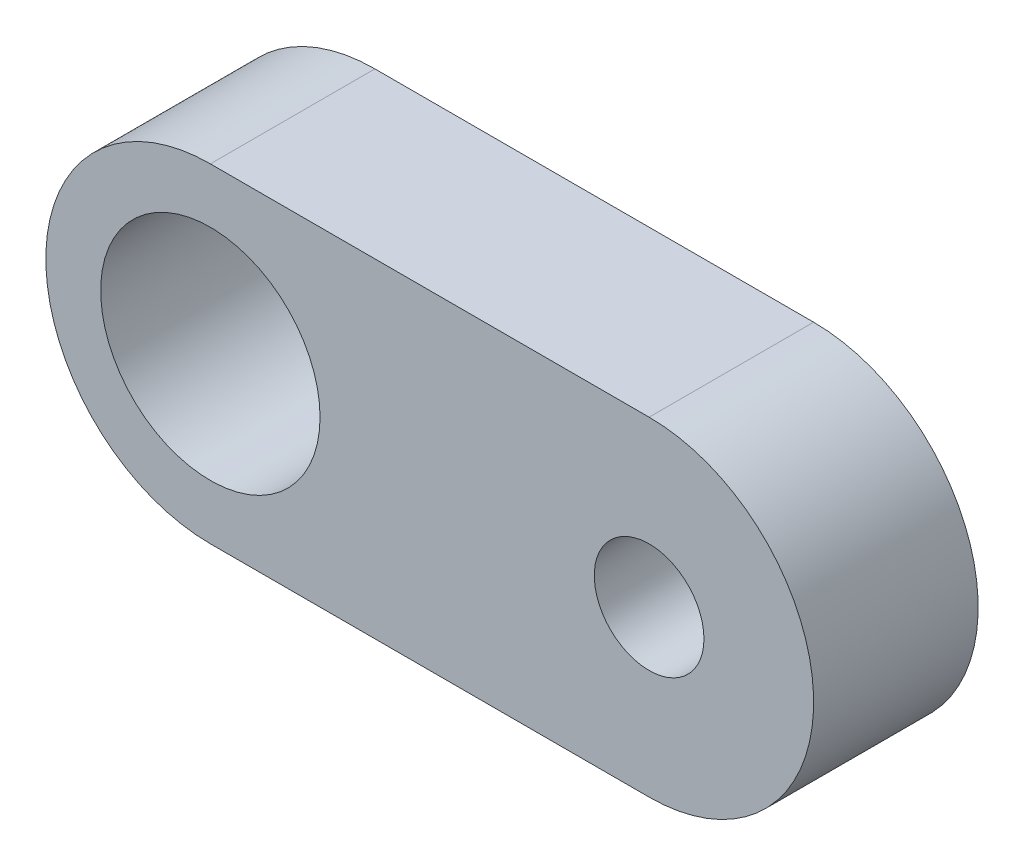
ISO-10303-21;
HEADER;
FILE_DESCRIPTION(('STEP AP214'),'2;1');
FILE_NAME('part.step','',(''),(''),'','','');
FILE_SCHEMA(('AUTOMOTIVE_DESIGN { 1 0 10303 214 1 1 1 1 }'));
ENDSEC;
DATA;
#1=APPLICATION_CONTEXT('core data for automotive mechanical design processes');
#2=APPLICATION_PROTOCOL_DEFINITION('international standard','automotive_design',2000,#1);
#3=PRODUCT_CONTEXT('',#1,'mechanical');
#4=PRODUCT('Part','Part','',(#3));
#5=PRODUCT_RELATED_PRODUCT_CATEGORY('part','',(#4));
#6=PRODUCT_DEFINITION_FORMATION('','',#4);
#7=PRODUCT_DEFINITION_CONTEXT('part definition',#1,'design');
#8=PRODUCT_DEFINITION('design','',#6,#7);
#9=PRODUCT_DEFINITION_SHAPE('','',#8);
#10=(LENGTH_UNIT() NAMED_UNIT(*) SI_UNIT(.MILLI.,.METRE.));
#11=(NAMED_UNIT(*) PLANE_ANGLE_UNIT() SI_UNIT($,.RADIAN.));
#12=(NAMED_UNIT(*) SI_UNIT($,.STERADIAN.) SOLID_ANGLE_UNIT());
#13=UNCERTAINTY_MEASURE_WITH_UNIT(LENGTH_MEASURE(1.E-05),#10,'distance_accuracy_value','');
#14=(GEOMETRIC_REPRESENTATION_CONTEXT(3) GLOBAL_UNCERTAINTY_ASSIGNED_CONTEXT((#13)) GLOBAL_UNIT_ASSIGNED_CONTEXT((#10,
#11,#12)) REPRESENTATION_CONTEXT('',''));
#15=CARTESIAN_POINT('',(0.,0.,0.));
#16=DIRECTION('',(0.,0.,1.));
#17=DIRECTION('',(1.,0.,0.));
#18=AXIS2_PLACEMENT_3D('',#15,#16,#17);
#19=CARTESIAN_POINT('',(8.,0.,3.));
#20=DIRECTION('',(0.,0.,-1.));
#21=DIRECTION('',(-1.,0.,0.));
#22=AXIS2_PLACEMENT_3D('',#19,#20,#21);
#23=PLANE('',#22);
#24=CARTESIAN_POINT('',(8.,0.,3.));
#25=DIRECTION('',(0.,0.,1.));
#26=DIRECTION('',(-1.,0.,0.));
#27=AXIS2_PLACEMENT_3D('',#24,#25,#26);
#28=CIRCLE('',#27,3.);
#29=CARTESIAN_POINT('',(8.,-3.,3.));
#30=VERTEX_POINT('',#29);
#31=CARTESIAN_POINT('',(8.,3.,3.));
#32=VERTEX_POINT('',#31);
#33=EDGE_CURVE('E50',#30,#32,#28,.T.);
#34=ORIENTED_EDGE('',*,*,#33,.T.);
#35=DIRECTION('',(-1.,0.,0.));
#36=VECTOR('',#35,1.);
#37=CARTESIAN_POINT('',(0.,3.,3.));
#38=LINE('',#37,#36);
#39=CARTESIAN_POINT('',(0.,3.,3.));
#40=VERTEX_POINT('',#39);
#41=EDGE_CURVE('E81',#32,#40,#38,.T.);
#42=ORIENTED_EDGE('',*,*,#41,.T.);
#43=CARTESIAN_POINT('',(0.,0.,3.));
#44=DIRECTION('',(0.,0.,1.));
#45=DIRECTION('',(1.,0.,0.));
#46=AXIS2_PLACEMENT_3D('',#43,#44,#45);
#47=CIRCLE('',#46,3.);
#48=CARTESIAN_POINT('',(0.,-3.,3.));
#49=VERTEX_POINT('',#48);
#50=EDGE_CURVE('E85',#40,#49,#47,.T.);
#51=ORIENTED_EDGE('',*,*,#50,.T.);
#52=DIRECTION('',(1.,0.,0.));
#53=VECTOR('',#52,1.);
#54=CARTESIAN_POINT('',(8.,-3.,3.));
#55=LINE('',#54,#53);
#56=EDGE_CURVE('E92',#49,#30,#55,.T.);
#57=ORIENTED_EDGE('',*,*,#56,.T.);
#58=EDGE_LOOP('',(#34,#42,#51,#57));
#59=FACE_BOUND('',#58,.T.);
#60=CARTESIAN_POINT('',(0.,0.,3.));
#61=DIRECTION('',(0.,0.,1.));
#62=DIRECTION('',(1.,0.,0.));
#63=AXIS2_PLACEMENT_3D('',#60,#61,#62);
#64=CIRCLE('',#63,2.);
#65=CARTESIAN_POINT('',(2.,0.,3.));
#66=VERTEX_POINT('',#65);
#67=EDGE_CURVE('E99',#66,#66,#64,.T.);
#68=ORIENTED_EDGE('',*,*,#67,.F.);
#69=EDGE_LOOP('',(#68));
#70=FACE_BOUND('',#69,.T.);
#71=CARTESIAN_POINT('',(8.,0.,3.));
#72=DIRECTION('',(0.,0.,1.));
#73=DIRECTION('',(1.,0.,0.));
#74=AXIS2_PLACEMENT_3D('',#71,#72,#73);
#75=CIRCLE('',#74,1.);
#76=CARTESIAN_POINT('',(9.,0.,3.));
#77=VERTEX_POINT('',#76);
#78=EDGE_CURVE('E137',#77,#77,#75,.T.);
#79=ORIENTED_EDGE('',*,*,#78,.F.);
#80=EDGE_LOOP('',(#79));
#81=FACE_BOUND('',#80,.T.);
#82=ADVANCED_FACE('F33',(#59,#70,#81),#23,.F.);
#83=CARTESIAN_POINT('',(8.,0.,0.));
#84=DIRECTION('',(0.,0.,-1.));
#85=DIRECTION('',(-1.,0.,0.));
#86=AXIS2_PLACEMENT_3D('',#83,#84,#85);
#87=PLANE('',#86);
#88=CARTESIAN_POINT('',(0.,0.,0.));
#89=DIRECTION('',(0.,0.,1.));
#90=DIRECTION('',(1.,0.,0.));
#91=AXIS2_PLACEMENT_3D('',#88,#89,#90);
#92=CIRCLE('',#91,2.);
#93=CARTESIAN_POINT('',(2.,0.,0.));
#94=VERTEX_POINT('',#93);
#95=EDGE_CURVE('E142',#94,#94,#92,.T.);
#96=ORIENTED_EDGE('',*,*,#95,.T.);
#97=EDGE_LOOP('',(#96));
#98=FACE_BOUND('',#97,.T.);
#99=DIRECTION('',(-1.,0.,0.));
#100=VECTOR('',#99,1.);
#101=CARTESIAN_POINT('',(0.,3.,0.));
#102=LINE('',#101,#100);
#103=CARTESIAN_POINT('',(8.,3.,0.));
#104=VERTEX_POINT('',#103);
#105=CARTESIAN_POINT('',(0.,3.,0.));
#106=VERTEX_POINT('',#105);
#107=EDGE_CURVE('E88',#104,#106,#102,.T.);
#108=ORIENTED_EDGE('',*,*,#107,.F.);
#109=CARTESIAN_POINT('',(8.,0.,0.));
#110=DIRECTION('',(0.,0.,1.));
#111=DIRECTION('',(-1.,0.,0.));
#112=AXIS2_PLACEMENT_3D('',#109,#110,#111);
#113=CIRCLE('',#112,3.);
#114=CARTESIAN_POINT('',(8.,-3.,0.));
#115=VERTEX_POINT('',#114);
#116=EDGE_CURVE('E102',#115,#104,#113,.T.);
#117=ORIENTED_EDGE('',*,*,#116,.F.);
#118=DIRECTION('',(1.,0.,0.));
#119=VECTOR('',#118,1.);
#120=CARTESIAN_POINT('',(8.,-3.,0.));
#121=LINE('',#120,#119);
#122=CARTESIAN_POINT('',(0.,-3.,0.));
#123=VERTEX_POINT('',#122);
#124=EDGE_CURVE('E75',#123,#115,#121,.T.);
#125=ORIENTED_EDGE('',*,*,#124,.F.);
#126=CARTESIAN_POINT('',(0.,0.,0.));
#127=DIRECTION('',(0.,0.,1.));
#128=DIRECTION('',(1.,0.,0.));
#129=AXIS2_PLACEMENT_3D('',#126,#127,#128);
#130=CIRCLE('',#129,3.);
#131=EDGE_CURVE('E68',#106,#123,#130,.T.);
#132=ORIENTED_EDGE('',*,*,#131,.F.);
#133=EDGE_LOOP('',(#108,#117,#125,#132));
#134=FACE_BOUND('',#133,.T.);
#135=CARTESIAN_POINT('',(8.,0.,0.));
#136=DIRECTION('',(0.,0.,1.));
#137=DIRECTION('',(1.,0.,0.));
#138=AXIS2_PLACEMENT_3D('',#135,#136,#137);
#139=CIRCLE('',#138,1.);
#140=CARTESIAN_POINT('',(9.,0.,0.));
#141=VERTEX_POINT('',#140);
#142=EDGE_CURVE('E140',#141,#141,#139,.T.);
#143=ORIENTED_EDGE('',*,*,#142,.T.);
#144=EDGE_LOOP('',(#143));
#145=FACE_BOUND('',#144,.T.);
#146=ADVANCED_FACE('F108',(#98,#134,#145),#87,.T.);
#147=CARTESIAN_POINT('',(0.,3.,3.));
#148=DIRECTION('',(0.,-1.,0.));
#149=DIRECTION('',(1.,0.,0.));
#150=AXIS2_PLACEMENT_3D('',#147,#148,#149);
#151=PLANE('',#150);
#152=ORIENTED_EDGE('',*,*,#107,.T.);
#153=DIRECTION('',(0.,0.,-1.));
#154=VECTOR('',#153,1.);
#155=CARTESIAN_POINT('',(0.,3.,3.));
#156=LINE('',#155,#154);
#157=EDGE_CURVE('E42',#40,#106,#156,.T.);
#158=ORIENTED_EDGE('',*,*,#157,.F.);
#159=ORIENTED_EDGE('',*,*,#41,.F.);
#160=DIRECTION('',(0.,0.,-1.));
#161=VECTOR('',#160,1.);
#162=CARTESIAN_POINT('',(8.,3.,3.));
#163=LINE('',#162,#161);
#164=EDGE_CURVE('E11',#32,#104,#163,.T.);
#165=ORIENTED_EDGE('',*,*,#164,.T.);
#166=EDGE_LOOP('',(#152,#158,#159,#165));
#167=FACE_BOUND('',#166,.T.);
#168=ADVANCED_FACE('F35',(#167),#151,.F.);
#169=CARTESIAN_POINT('',(0.,0.,3.));
#170=DIRECTION('',(0.,0.,-1.));
#171=DIRECTION('',(-1.,0.,0.));
#172=AXIS2_PLACEMENT_3D('',#169,#170,#171);
#173=CYLINDRICAL_SURFACE('',#172,3.);
#174=ORIENTED_EDGE('',*,*,#131,.T.);
#175=DIRECTION('',(0.,0.,-1.));
#176=VECTOR('',#175,1.);
#177=CARTESIAN_POINT('',(0.,-3.,3.));
#178=LINE('',#177,#176);
#179=EDGE_CURVE('E89',#49,#123,#178,.T.);
#180=ORIENTED_EDGE('',*,*,#179,.F.);
#181=ORIENTED_EDGE('',*,*,#50,.F.);
#182=ORIENTED_EDGE('',*,*,#157,.T.);
#183=EDGE_LOOP('',(#174,#180,#181,#182));
#184=FACE_BOUND('',#183,.T.);
#185=ADVANCED_FACE('F90',(#184),#173,.T.);
#186=CARTESIAN_POINT('',(8.,-3.,3.));
#187=DIRECTION('',(0.,1.,0.));
#188=DIRECTION('',(-1.,0.,0.));
#189=AXIS2_PLACEMENT_3D('',#186,#187,#188);
#190=PLANE('',#189);
#191=ORIENTED_EDGE('',*,*,#124,.T.);
#192=DIRECTION('',(0.,0.,-1.));
#193=VECTOR('',#192,1.);
#194=CARTESIAN_POINT('',(8.,-3.,3.));
#195=LINE('',#194,#193);
#196=EDGE_CURVE('E94',#30,#115,#195,.T.);
#197=ORIENTED_EDGE('',*,*,#196,.F.);
#198=ORIENTED_EDGE('',*,*,#56,.F.);
#199=ORIENTED_EDGE('',*,*,#179,.T.);
#200=EDGE_LOOP('',(#191,#197,#198,#199));
#201=FACE_BOUND('',#200,.T.);
#202=ADVANCED_FACE('F105',(#201),#190,.F.);
#203=CARTESIAN_POINT('',(8.,0.,3.));
#204=DIRECTION('',(0.,0.,-1.));
#205=DIRECTION('',(-1.,0.,0.));
#206=AXIS2_PLACEMENT_3D('',#203,#204,#205);
#207=CYLINDRICAL_SURFACE('',#206,3.);
#208=ORIENTED_EDGE('',*,*,#116,.T.);
#209=ORIENTED_EDGE('',*,*,#164,.F.);
#210=ORIENTED_EDGE('',*,*,#33,.F.);
#211=ORIENTED_EDGE('',*,*,#196,.T.);
#212=EDGE_LOOP('',(#208,#209,#210,#211));
#213=FACE_BOUND('',#212,.T.);
#214=ADVANCED_FACE('F110',(#213),#207,.T.);
#215=CARTESIAN_POINT('',(0.,0.,3.));
#216=DIRECTION('',(0.,0.,-1.));
#217=DIRECTION('',(-1.,0.,0.));
#218=AXIS2_PLACEMENT_3D('',#215,#216,#217);
#219=CYLINDRICAL_SURFACE('',#218,2.);
#220=ORIENTED_EDGE('',*,*,#67,.T.);
#221=EDGE_LOOP('',(#220));
#222=FACE_BOUND('',#221,.T.);
#223=ORIENTED_EDGE('',*,*,#95,.F.);
#224=EDGE_LOOP('',(#223));
#225=FACE_BOUND('',#224,.T.);
#226=ADVANCED_FACE('F112',(#222,#225),#219,.F.);
#227=CARTESIAN_POINT('',(8.,0.,3.));
#228=DIRECTION('',(0.,0.,-1.));
#229=DIRECTION('',(-1.,0.,0.));
#230=AXIS2_PLACEMENT_3D('',#227,#228,#229);
#231=CYLINDRICAL_SURFACE('',#230,1.);
#232=ORIENTED_EDGE('',*,*,#78,.T.);
#233=EDGE_LOOP('',(#232));
#234=FACE_BOUND('',#233,.T.);
#235=ORIENTED_EDGE('',*,*,#142,.F.);
#236=EDGE_LOOP('',(#235));
#237=FACE_BOUND('',#236,.T.);
#238=ADVANCED_FACE('F118',(#234,#237),#231,.F.);
#239=CLOSED_SHELL('',(#82,#146,#168,#185,#202,#214,#226,#238));
#240=MANIFOLD_SOLID_BREP('B2',#239);
#241=ADVANCED_BREP_SHAPE_REPRESENTATION('',(#18,#240),#14);
#242=SHAPE_DEFINITION_REPRESENTATION(#9,#241);
ENDSEC;
END-ISO-10303-21;
